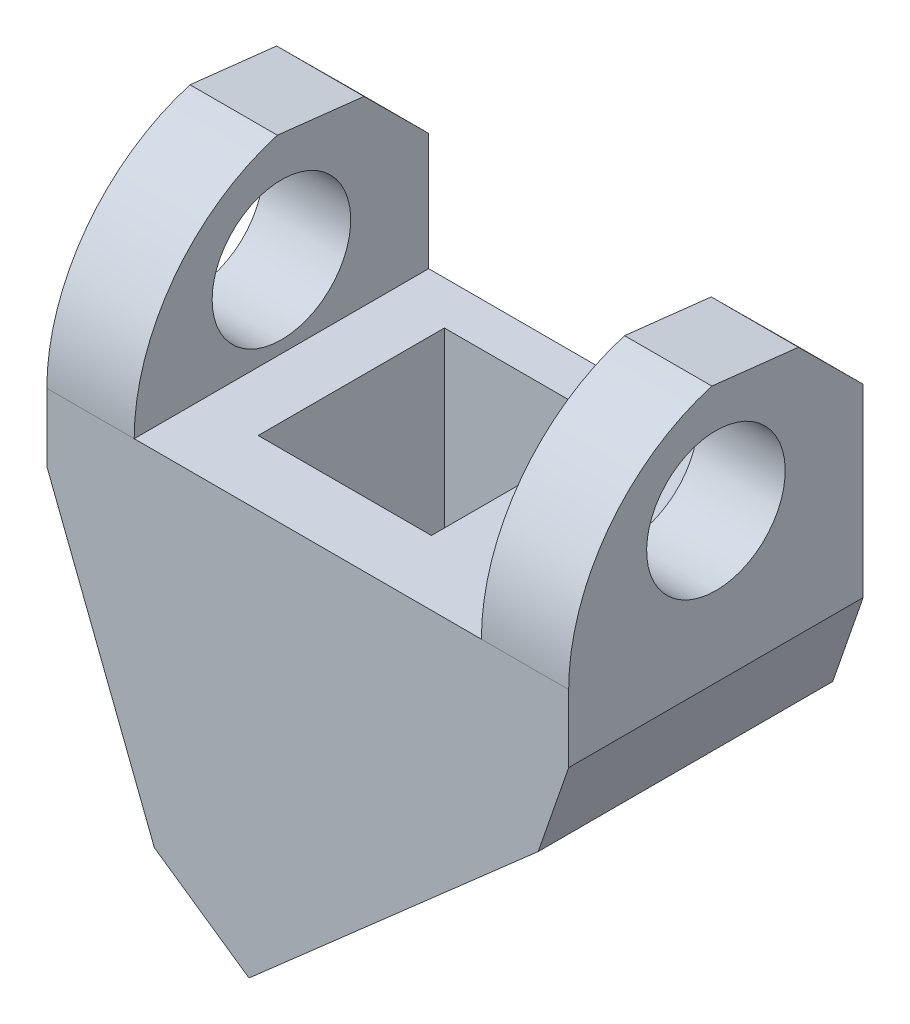
ISO-10303-21;
HEADER;
FILE_DESCRIPTION(('STEP AP214'),'2;1');
FILE_NAME('part.step','',(''),(''),'','','');
FILE_SCHEMA(('AUTOMOTIVE_DESIGN { 1 0 10303 214 1 1 1 1 }'));
ENDSEC;
DATA;
#1=APPLICATION_CONTEXT('core data for automotive mechanical design processes');
#2=APPLICATION_PROTOCOL_DEFINITION('international standard','automotive_design',2000,#1);
#3=PRODUCT_CONTEXT('',#1,'mechanical');
#4=PRODUCT('Part','Part','',(#3));
#5=PRODUCT_RELATED_PRODUCT_CATEGORY('part','',(#4));
#6=PRODUCT_DEFINITION_FORMATION('','',#4);
#7=PRODUCT_DEFINITION_CONTEXT('part definition',#1,'design');
#8=PRODUCT_DEFINITION('design','',#6,#7);
#9=PRODUCT_DEFINITION_SHAPE('','',#8);
#10=(LENGTH_UNIT() NAMED_UNIT(*) SI_UNIT(.MILLI.,.METRE.));
#11=(NAMED_UNIT(*) PLANE_ANGLE_UNIT() SI_UNIT($,.RADIAN.));
#12=(NAMED_UNIT(*) SI_UNIT($,.STERADIAN.) SOLID_ANGLE_UNIT());
#13=UNCERTAINTY_MEASURE_WITH_UNIT(LENGTH_MEASURE(1.E-05),#10,'distance_accuracy_value','');
#14=(GEOMETRIC_REPRESENTATION_CONTEXT(3) GLOBAL_UNCERTAINTY_ASSIGNED_CONTEXT((#13)) GLOBAL_UNIT_ASSIGNED_CONTEXT((#10,
#11,#12)) REPRESENTATION_CONTEXT('',''));
#15=CARTESIAN_POINT('',(0.,0.,0.));
#16=DIRECTION('',(0.,0.,1.));
#17=DIRECTION('',(1.,0.,0.));
#18=AXIS2_PLACEMENT_3D('',#15,#16,#17);
#19=CARTESIAN_POINT('',(-15.0393152654087,68.1555665634377,2.51494935882963));
#20=DIRECTION('',(0.,0.,1.));
#21=DIRECTION('',(0.,-1.,0.));
#22=AXIS2_PLACEMENT_3D('',#19,#20,#21);
#23=PLANE('',#22);
#24=DIRECTION('',(0.,-1.,0.));
#25=VECTOR('',#24,1.);
#26=CARTESIAN_POINT('',(-22.0839997464418,68.1555665634377,2.51494935882964));
#27=LINE('',#26,#25);
#28=CARTESIAN_POINT('',(-22.0839997464418,75.2475364005169,2.51494935882963));
#29=VERTEX_POINT('',#28);
#30=CARTESIAN_POINT('',(-22.0839997464418,73.4824145089119,2.51494935882963));
#31=VERTEX_POINT('',#30);
#32=EDGE_CURVE('E251',#29,#31,#27,.T.);
#33=ORIENTED_EDGE('',*,*,#32,.F.);
#34=DIRECTION('',(0.751257399724713,0.660009332781638,0.));
#35=VECTOR('',#34,1.);
#36=CARTESIAN_POINT('',(-23.163789117237,74.2988987399436,2.51494935882963));
#37=LINE('',#36,#35);
#38=CARTESIAN_POINT('',(-23.1637891172367,74.2988987399439,2.51494935882963));
#39=VERTEX_POINT('',#38);
#40=EDGE_CURVE('E297',#39,#29,#37,.T.);
#41=ORIENTED_EDGE('',*,*,#40,.F.);
#42=DIRECTION('',(-0.797638676251072,0.603135591843523,0.));
#43=VECTOR('',#42,1.);
#44=CARTESIAN_POINT('',(-15.0393152654087,68.1555665634377,2.51494935882963));
#45=LINE('',#44,#43);
#46=EDGE_CURVE('E290',#31,#39,#45,.T.);
#47=ORIENTED_EDGE('',*,*,#46,.F.);
#48=EDGE_LOOP('',(#33,#41,#47));
#49=FACE_BOUND('',#48,.T.);
#50=ADVANCED_FACE('F43',(#49),#23,.T.);
#51=CARTESIAN_POINT('',(-2.1795730675306,80.7846244199642,17.));
#52=DIRECTION('',(-0.660009332781638,0.751257399724713,0.));
#53=DIRECTION('',(-0.751257399724713,-0.660009332781638,0.));
#54=AXIS2_PLACEMENT_3D('',#51,#52,#53);
#55=PLANE('',#54);
#56=DIRECTION('',(0.751257399724713,0.660009332781638,0.));
#57=VECTOR('',#56,1.);
#58=CARTESIAN_POINT('',(-2.1795730675306,80.7846244199642,0.));
#59=LINE('',#58,#57);
#60=CARTESIAN_POINT('',(-18.8741251235288,66.1178002827174,0.));
#61=VERTEX_POINT('',#60);
#62=CARTESIAN_POINT('',(-2.1795730675306,80.7846244199642,0.));
#63=VERTEX_POINT('',#62);
#64=EDGE_CURVE('E399',#61,#63,#59,.T.);
#65=ORIENTED_EDGE('',*,*,#64,.T.);
#66=DIRECTION('',(0.,0.,-1.));
#67=VECTOR('',#66,1.);
#68=CARTESIAN_POINT('',(-2.1795730675306,80.7846244199642,17.));
#69=LINE('',#68,#67);
#70=CARTESIAN_POINT('',(-2.1795730675306,80.7846244199642,17.));
#71=VERTEX_POINT('',#70);
#72=EDGE_CURVE('E429',#71,#63,#69,.T.);
#73=ORIENTED_EDGE('',*,*,#72,.F.);
#74=DIRECTION('',(0.751257399724713,0.660009332781638,0.));
#75=VECTOR('',#74,1.);
#76=CARTESIAN_POINT('',(-2.1795730675306,80.7846244199642,17.));
#77=LINE('',#76,#75);
#78=CARTESIAN_POINT('',(-18.8741251235288,66.1178002827174,17.));
#79=VERTEX_POINT('',#78);
#80=EDGE_CURVE('E376',#79,#71,#77,.T.);
#81=ORIENTED_EDGE('',*,*,#80,.F.);
#82=DIRECTION('',(0.,0.,-1.));
#83=VECTOR('',#82,1.);
#84=CARTESIAN_POINT('',(-18.8741251235288,66.1178002827174,17.));
#85=LINE('',#84,#83);
#86=EDGE_CURVE('E433',#79,#61,#85,.T.);
#87=ORIENTED_EDGE('',*,*,#86,.T.);
#88=EDGE_LOOP('',(#65,#73,#81,#87));
#89=FACE_BOUND('',#88,.T.);
#90=DIRECTION('',(-0.751257399724713,-0.660009332781638,0.));
#91=VECTOR('',#90,1.);
#92=CARTESIAN_POINT('',(-15.6994059763522,68.9069165920742,2.51494935882963));
#93=LINE('',#92,#91);
#94=CARTESIAN_POINT('',(-8.73660731213499,75.0240105499464,2.51494935882963));
#95=VERTEX_POINT('',#94);
#96=CARTESIAN_POINT('',(-12.0839997464418,72.083193929791,2.51494935882963));
#97=VERTEX_POINT('',#96);
#98=EDGE_CURVE('E268',#95,#97,#93,.T.);
#99=ORIENTED_EDGE('',*,*,#98,.T.);
#100=DIRECTION('',(0.,0.,-1.));
#101=VECTOR('',#100,1.);
#102=CARTESIAN_POINT('',(-12.0839997464418,72.083193929791,17.));
#103=LINE('',#102,#101);
#104=CARTESIAN_POINT('',(-12.0839997464418,72.083193929791,2.51));
#105=VERTEX_POINT('',#104);
#106=EDGE_CURVE('E259',#97,#105,#103,.T.);
#107=ORIENTED_EDGE('',*,*,#106,.T.);
#108=DIRECTION('',(-0.751257399724713,-0.660009332781638,0.));
#109=VECTOR('',#108,1.);
#110=CARTESIAN_POINT('',(-2.1795730675306,80.7846244199642,2.51));
#111=LINE('',#110,#109);
#112=CARTESIAN_POINT('',(-15.8536990704591,68.7713640076582,2.51));
#113=VERTEX_POINT('',#112);
#114=EDGE_CURVE('E263',#105,#113,#111,.T.);
#115=ORIENTED_EDGE('',*,*,#114,.T.);
#116=DIRECTION('',(0.,0.,1.));
#117=VECTOR('',#116,1.);
#118=CARTESIAN_POINT('',(-15.8536990704591,68.7713640076582,13.2610917761324));
#119=LINE('',#118,#117);
#120=CARTESIAN_POINT('',(-15.8536990704591,68.7713640076582,13.2610917761324));
#121=VERTEX_POINT('',#120);
#122=EDGE_CURVE('E272',#113,#121,#119,.T.);
#123=ORIENTED_EDGE('',*,*,#122,.T.);
#124=DIRECTION('',(0.751257399724713,0.660009332781638,0.));
#125=VECTOR('',#124,1.);
#126=CARTESIAN_POINT('',(-8.58231421802809,75.1595631343624,13.2610917761324));
#127=LINE('',#126,#125);
#128=CARTESIAN_POINT('',(-8.73660731213499,75.0240105499464,13.2610917761324));
#129=VERTEX_POINT('',#128);
#130=EDGE_CURVE('E276',#121,#129,#127,.T.);
#131=ORIENTED_EDGE('',*,*,#130,.T.);
#132=DIRECTION('',(0.,0.,-1.));
#133=VECTOR('',#132,1.);
#134=CARTESIAN_POINT('',(-8.73660731213499,75.0240105499464,2.51494935882963));
#135=LINE('',#134,#133);
#136=EDGE_CURVE('E273',#129,#95,#135,.T.);
#137=ORIENTED_EDGE('',*,*,#136,.T.);
#138=EDGE_LOOP('',(#99,#107,#115,#123,#131,#137));
#139=FACE_BOUND('',#138,.T.);
#140=ADVANCED_FACE('F499',(#89,#139),#55,.F.);
#141=CARTESIAN_POINT('',(0.,0.,17.));
#142=DIRECTION('',(0.,0.,-1.));
#143=DIRECTION('',(-1.,0.,0.));
#144=AXIS2_PLACEMENT_3D('',#141,#142,#143);
#145=PLANE('',#144);
#146=DIRECTION('',(-1.,0.,0.));
#147=VECTOR('',#146,1.);
#148=CARTESIAN_POINT('',(18.4980253948452,89.7634252905846,17.));
#149=LINE('',#148,#147);
#150=CARTESIAN_POINT('',(-30.5439997464418,89.7634252905846,17.));
#151=VERTEX_POINT('',#150);
#152=CARTESIAN_POINT('',(-25.5019746051548,89.7634252905846,17.));
#153=VERTEX_POINT('',#152);
#154=EDGE_CURVE('E452',#151,#153,#149,.F.);
#155=ORIENTED_EDGE('',*,*,#154,.F.);
#156=DIRECTION('',(0.,-1.,0.));
#157=VECTOR('',#156,1.);
#158=CARTESIAN_POINT('',(-30.5439997464418,85.8614227175712,17.));
#159=LINE('',#158,#157);
#160=CARTESIAN_POINT('',(-30.5439997464418,85.8614227175712,17.));
#161=VERTEX_POINT('',#160);
#162=EDGE_CURVE('E366',#151,#161,#159,.T.);
#163=ORIENTED_EDGE('',*,*,#162,.T.);
#164=DIRECTION('',(0.362427694111266,-0.932011891845373,0.));
#165=VECTOR('',#164,1.);
#166=CARTESIAN_POINT('',(-24.3369525661396,69.899502921478,17.));
#167=LINE('',#166,#165);
#168=CARTESIAN_POINT('',(-24.3369525661396,69.899502921478,17.));
#169=VERTEX_POINT('',#168);
#170=EDGE_CURVE('E369',#161,#169,#167,.T.);
#171=ORIENTED_EDGE('',*,*,#170,.T.);
#172=DIRECTION('',(0.822210140525287,-0.569184051794661,0.));
#173=VECTOR('',#172,1.);
#174=CARTESIAN_POINT('',(-18.8741251235288,66.1178002827174,17.));
#175=LINE('',#174,#173);
#176=EDGE_CURVE('E373',#169,#79,#175,.T.);
#177=ORIENTED_EDGE('',*,*,#176,.T.);
#178=ORIENTED_EDGE('',*,*,#80,.T.);
#179=DIRECTION('',(0.327290063128933,0.944923919994123,0.));
#180=VECTOR('',#179,1.);
#181=CARTESIAN_POINT('',(-0.421139822103817,85.8614227175712,17.));
#182=LINE('',#181,#180);
#183=CARTESIAN_POINT('',(-0.421139822103817,85.8614227175712,17.));
#184=VERTEX_POINT('',#183);
#185=EDGE_CURVE('E379',#71,#184,#182,.T.);
#186=ORIENTED_EDGE('',*,*,#185,.T.);
#187=DIRECTION('',(0.,1.,0.));
#188=VECTOR('',#187,1.);
#189=CARTESIAN_POINT('',(-0.421139822103861,100.861422717571,17.));
#190=LINE('',#189,#188);
#191=CARTESIAN_POINT('',(-0.421139822103841,89.7634252905846,17.));
#192=VERTEX_POINT('',#191);
#193=EDGE_CURVE('E382',#184,#192,#190,.T.);
#194=ORIENTED_EDGE('',*,*,#193,.T.);
#195=CARTESIAN_POINT('',(-5.45945062258354,89.7634252905846,17.));
#196=VERTEX_POINT('',#195);
#197=EDGE_CURVE('E449',#196,#192,#149,.F.);
#198=ORIENTED_EDGE('',*,*,#197,.F.);
#199=DIRECTION('',(-1.,0.,0.));
#200=VECTOR('',#199,1.);
#201=CARTESIAN_POINT('',(-25.5019746051548,89.7634252905846,17.));
#202=LINE('',#201,#200);
#203=EDGE_CURVE('E386',#196,#153,#202,.T.);
#204=ORIENTED_EDGE('',*,*,#203,.T.);
#205=EDGE_LOOP('',(#155,#163,#171,#177,#178,#186,#194,#198,#204));
#206=FACE_BOUND('',#205,.T.);
#207=ADVANCED_FACE('F468',(#206),#145,.F.);
#208=CARTESIAN_POINT('',(-30.5439997464418,85.8614227175712,17.));
#209=DIRECTION('',(1.,0.,0.));
#210=DIRECTION('',(0.,1.,0.));
#211=AXIS2_PLACEMENT_3D('',#208,#209,#210);
#212=PLANE('',#211);
#213=CARTESIAN_POINT('',(-30.5439997464418,94.4592808428831,8.5));
#214=DIRECTION('',(-1.,0.,0.));
#215=DIRECTION('',(0.,-1.,0.));
#216=AXIS2_PLACEMENT_3D('',#213,#214,#215);
#217=CIRCLE('',#216,4.);
#218=CARTESIAN_POINT('',(-30.5439997464418,90.4592808428831,8.5));
#219=VERTEX_POINT('',#218);
#220=EDGE_CURVE('E541',#219,#219,#217,.T.);
#221=ORIENTED_EDGE('',*,*,#220,.F.);
#222=EDGE_LOOP('',(#221));
#223=FACE_BOUND('',#222,.T.);
#224=ORIENTED_EDGE('',*,*,#162,.F.);
#225=CARTESIAN_POINT('',(-30.5439997464418,89.7634252905846,5.49450288206386));
#226=DIRECTION('',(1.,0.,0.));
#227=DIRECTION('',(0.,1.,0.));
#228=AXIS2_PLACEMENT_3D('',#225,#226,#227);
#229=CIRCLE('',#228,11.5054971179361);
#230=CARTESIAN_POINT('',(-30.5439997464418,100.803448871588,8.73400026001036));
#231=VERTEX_POINT('',#230);
#232=EDGE_CURVE('E349',#151,#231,#229,.F.);
#233=ORIENTED_EDGE('',*,*,#232,.T.);
#234=DIRECTION('',(0.,-0.111700323808087,-0.9937419371553));
#235=VECTOR('',#234,1.);
#236=CARTESIAN_POINT('',(-30.5439997464418,101.534554459212,15.2382811621701));
#237=LINE('',#236,#235);
#238=CARTESIAN_POINT('',(-30.5439997464418,100.241430103779,3.73400026001036));
#239=VERTEX_POINT('',#238);
#240=EDGE_CURVE('E361',#231,#239,#237,.T.);
#241=ORIENTED_EDGE('',*,*,#240,.T.);
#242=DIRECTION('',(0.,-0.705206396881613,-0.709002071786291));
#243=VECTOR('',#242,1.);
#244=CARTESIAN_POINT('',(-30.5439997464418,99.7229257634078,3.21270514246909));
#245=LINE('',#244,#243);
#246=CARTESIAN_POINT('',(-30.5439997464418,96.5274199843407,0.));
#247=VERTEX_POINT('',#246);
#248=EDGE_CURVE('E333',#239,#247,#245,.T.);
#249=ORIENTED_EDGE('',*,*,#248,.T.);
#250=DIRECTION('',(0.,-1.,0.));
#251=VECTOR('',#250,1.);
#252=CARTESIAN_POINT('',(-30.5439997464418,85.8614227175712,0.));
#253=LINE('',#252,#251);
#254=CARTESIAN_POINT('',(-30.5439997464418,85.8614227175712,0.));
#255=VERTEX_POINT('',#254);
#256=EDGE_CURVE('E365',#247,#255,#253,.T.);
#257=ORIENTED_EDGE('',*,*,#256,.T.);
#258=DIRECTION('',(0.,0.,-1.));
#259=VECTOR('',#258,1.);
#260=CARTESIAN_POINT('',(-30.5439997464418,85.8614227175712,17.));
#261=LINE('',#260,#259);
#262=EDGE_CURVE('E441',#161,#255,#261,.T.);
#263=ORIENTED_EDGE('',*,*,#262,.F.);
#264=EDGE_LOOP('',(#224,#233,#241,#249,#257,#263));
#265=FACE_BOUND('',#264,.T.);
#266=ADVANCED_FACE('F45',(#223,#265),#212,.F.);
#267=CARTESIAN_POINT('',(-24.3369525661396,69.899502921478,17.));
#268=DIRECTION('',(0.932011891845373,0.362427694111266,0.));
#269=DIRECTION('',(-0.362427694111266,0.932011891845373,0.));
#270=AXIS2_PLACEMENT_3D('',#267,#268,#269);
#271=PLANE('',#270);
#272=DIRECTION('',(0.362427694111266,-0.932011891845373,0.));
#273=VECTOR('',#272,1.);
#274=CARTESIAN_POINT('',(-24.3369525661396,69.899502921478,0.));
#275=LINE('',#274,#273);
#276=CARTESIAN_POINT('',(-24.3369525661396,69.899502921478,0.));
#277=VERTEX_POINT('',#276);
#278=EDGE_CURVE('E393',#255,#277,#275,.T.);
#279=ORIENTED_EDGE('',*,*,#278,.T.);
#280=DIRECTION('',(0.,0.,-1.));
#281=VECTOR('',#280,1.);
#282=CARTESIAN_POINT('',(-24.3369525661396,69.899502921478,17.));
#283=LINE('',#282,#281);
#284=EDGE_CURVE('E437',#169,#277,#283,.T.);
#285=ORIENTED_EDGE('',*,*,#284,.F.);
#286=ORIENTED_EDGE('',*,*,#170,.F.);
#287=ORIENTED_EDGE('',*,*,#262,.T.);
#288=EDGE_LOOP('',(#279,#285,#286,#287));
#289=FACE_BOUND('',#288,.T.);
#290=ADVANCED_FACE('F487',(#289),#271,.F.);
#291=CARTESIAN_POINT('',(-18.8741251235288,66.1178002827174,17.));
#292=DIRECTION('',(0.569184051794661,0.822210140525287,0.));
#293=DIRECTION('',(-0.822210140525287,0.569184051794661,0.));
#294=AXIS2_PLACEMENT_3D('',#291,#292,#293);
#295=PLANE('',#294);
#296=DIRECTION('',(0.822210140525287,-0.569184051794661,0.));
#297=VECTOR('',#296,1.);
#298=CARTESIAN_POINT('',(-18.8741251235288,66.1178002827174,0.));
#299=LINE('',#298,#297);
#300=EDGE_CURVE('E396',#277,#61,#299,.T.);
#301=ORIENTED_EDGE('',*,*,#300,.T.);
#302=ORIENTED_EDGE('',*,*,#86,.F.);
#303=ORIENTED_EDGE('',*,*,#176,.F.);
#304=ORIENTED_EDGE('',*,*,#284,.T.);
#305=EDGE_LOOP('',(#301,#302,#303,#304));
#306=FACE_BOUND('',#305,.T.);
#307=ADVANCED_FACE('F493',(#306),#295,.F.);
#308=CARTESIAN_POINT('',(-0.421139822103817,85.8614227175712,17.));
#309=DIRECTION('',(-0.944923919994123,0.327290063128933,0.));
#310=DIRECTION('',(-0.327290063128933,-0.944923919994123,0.));
#311=AXIS2_PLACEMENT_3D('',#308,#309,#310);
#312=PLANE('',#311);
#313=DIRECTION('',(0.327290063128933,0.944923919994123,0.));
#314=VECTOR('',#313,1.);
#315=CARTESIAN_POINT('',(-0.421139822103817,85.8614227175712,0.));
#316=LINE('',#315,#314);
#317=CARTESIAN_POINT('',(-0.421139822103817,85.8614227175712,0.));
#318=VERTEX_POINT('',#317);
#319=EDGE_CURVE('E402',#63,#318,#316,.T.);
#320=ORIENTED_EDGE('',*,*,#319,.T.);
#321=DIRECTION('',(0.,0.,-1.));
#322=VECTOR('',#321,1.);
#323=CARTESIAN_POINT('',(-0.421139822103817,85.8614227175712,17.));
#324=LINE('',#323,#322);
#325=EDGE_CURVE('E425',#184,#318,#324,.T.);
#326=ORIENTED_EDGE('',*,*,#325,.F.);
#327=ORIENTED_EDGE('',*,*,#185,.F.);
#328=ORIENTED_EDGE('',*,*,#72,.T.);
#329=EDGE_LOOP('',(#320,#326,#327,#328));
#330=FACE_BOUND('',#329,.T.);
#331=ADVANCED_FACE('F504',(#330),#312,.F.);
#332=CARTESIAN_POINT('',(-0.421139822103861,100.861422717571,17.));
#333=DIRECTION('',(-1.,0.,0.));
#334=DIRECTION('',(0.,-1.,0.));
#335=AXIS2_PLACEMENT_3D('',#332,#333,#334);
#336=PLANE('',#335);
#337=CARTESIAN_POINT('',(-0.421139822103817,94.4592808428831,8.5));
#338=DIRECTION('',(-1.,0.,0.));
#339=DIRECTION('',(0.,-1.,0.));
#340=AXIS2_PLACEMENT_3D('',#337,#338,#339);
#341=CIRCLE('',#340,4.);
#342=CARTESIAN_POINT('',(-0.421139822103816,90.4592808428831,8.5));
#343=VERTEX_POINT('',#342);
#344=EDGE_CURVE('E536',#343,#343,#341,.T.);
#345=ORIENTED_EDGE('',*,*,#344,.T.);
#346=EDGE_LOOP('',(#345));
#347=FACE_BOUND('',#346,.T.);
#348=DIRECTION('',(0.,0.111700323808087,0.9937419371553));
#349=VECTOR('',#348,1.);
#350=CARTESIAN_POINT('',(-0.421139822103864,101.721708894294,16.903300604599));
#351=LINE('',#350,#349);
#352=CARTESIAN_POINT('',(-0.421139822103855,100.241430103779,3.73400026001036));
#353=VERTEX_POINT('',#352);
#354=CARTESIAN_POINT('',(-0.421139822103862,100.803448871588,8.73400026001036));
#355=VERTEX_POINT('',#354);
#356=EDGE_CURVE('E357',#353,#355,#351,.T.);
#357=ORIENTED_EDGE('',*,*,#356,.T.);
#358=CARTESIAN_POINT('',(-0.42113982210383,89.7634252905846,5.49450288206386));
#359=DIRECTION('',(-1.,0.,0.));
#360=DIRECTION('',(0.,-1.,0.));
#361=AXIS2_PLACEMENT_3D('',#358,#359,#360);
#362=CIRCLE('',#361,11.5054971179361);
#363=EDGE_CURVE('E345',#355,#192,#362,.F.);
#364=ORIENTED_EDGE('',*,*,#363,.T.);
#365=ORIENTED_EDGE('',*,*,#193,.F.);
#366=ORIENTED_EDGE('',*,*,#325,.T.);
#367=DIRECTION('',(0.,1.,0.));
#368=VECTOR('',#367,1.);
#369=CARTESIAN_POINT('',(-0.421139822103861,100.861422717571,0.));
#370=LINE('',#369,#368);
#371=CARTESIAN_POINT('',(-0.421139822103848,96.5274199843407,0.));
#372=VERTEX_POINT('',#371);
#373=EDGE_CURVE('E405',#318,#372,#370,.T.);
#374=ORIENTED_EDGE('',*,*,#373,.T.);
#375=DIRECTION('',(0.,0.705206396881613,0.709002071786291));
#376=VECTOR('',#375,1.);
#377=CARTESIAN_POINT('',(-0.42113982210388,107.182666696449,10.7125970888592));
#378=LINE('',#377,#376);
#379=EDGE_CURVE('E329',#372,#353,#378,.T.);
#380=ORIENTED_EDGE('',*,*,#379,.T.);
#381=EDGE_LOOP('',(#357,#364,#365,#366,#374,#380));
#382=FACE_BOUND('',#381,.T.);
#383=ADVANCED_FACE('F508',(#347,#382),#336,.F.);
#384=CARTESIAN_POINT('',(-5.45945062258354,89.7634252905846,17.));
#385=DIRECTION('',(1.,0.,0.));
#386=DIRECTION('',(0.,1.,0.));
#387=AXIS2_PLACEMENT_3D('',#384,#385,#386);
#388=PLANE('',#387);
#389=CARTESIAN_POINT('',(-5.45945062258354,94.4592808428831,8.5));
#390=DIRECTION('',(1.,0.,0.));
#391=DIRECTION('',(0.,1.,0.));
#392=AXIS2_PLACEMENT_3D('',#389,#390,#391);
#393=CIRCLE('',#392,4.);
#394=CARTESIAN_POINT('',(-5.45945062258354,98.4592808428831,8.5));
#395=VERTEX_POINT('',#394);
#396=EDGE_CURVE('E527',#395,#395,#393,.T.);
#397=ORIENTED_EDGE('',*,*,#396,.T.);
#398=EDGE_LOOP('',(#397));
#399=FACE_BOUND('',#398,.T.);
#400=DIRECTION('',(0.,0.,-1.));
#401=VECTOR('',#400,1.);
#402=CARTESIAN_POINT('',(-5.45945062258354,89.7634252905846,17.));
#403=LINE('',#402,#401);
#404=CARTESIAN_POINT('',(-5.45945062258354,89.7634252905846,0.));
#405=VERTEX_POINT('',#404);
#406=EDGE_CURVE('E421',#196,#405,#403,.T.);
#407=ORIENTED_EDGE('',*,*,#406,.F.);
#408=CARTESIAN_POINT('',(-5.45945062258354,89.7634252905846,5.49450288206386));
#409=DIRECTION('',(1.,0.,0.));
#410=DIRECTION('',(0.,1.,0.));
#411=AXIS2_PLACEMENT_3D('',#408,#409,#410);
#412=CIRCLE('',#411,11.5054971179361);
#413=CARTESIAN_POINT('',(-5.45945062258354,100.803448871588,8.73400026001036));
#414=VERTEX_POINT('',#413);
#415=EDGE_CURVE('E341',#196,#414,#412,.F.);
#416=ORIENTED_EDGE('',*,*,#415,.T.);
#417=DIRECTION('',(0.,-0.111700323808087,-0.9937419371553));
#418=VECTOR('',#417,1.);
#419=CARTESIAN_POINT('',(-5.45945062258354,101.583239598361,15.6714085054018));
#420=LINE('',#419,#418);
#421=CARTESIAN_POINT('',(-5.45945062258354,100.241430103779,3.73400026001036));
#422=VERTEX_POINT('',#421);
#423=EDGE_CURVE('E353',#414,#422,#420,.T.);
#424=ORIENTED_EDGE('',*,*,#423,.T.);
#425=DIRECTION('',(0.,-0.705206396881613,-0.709002071786291));
#426=VECTOR('',#425,1.);
#427=CARTESIAN_POINT('',(-5.45945062258354,101.663454317724,5.1636783206115));
#428=LINE('',#427,#426);
#429=CARTESIAN_POINT('',(-5.45945062258354,96.5274199843407,0.));
#430=VERTEX_POINT('',#429);
#431=EDGE_CURVE('E325',#422,#430,#428,.T.);
#432=ORIENTED_EDGE('',*,*,#431,.T.);
#433=DIRECTION('',(0.,-1.,0.));
#434=VECTOR('',#433,1.);
#435=CARTESIAN_POINT('',(-5.45945062258354,89.7634252905846,0.));
#436=LINE('',#435,#434);
#437=EDGE_CURVE('E409',#430,#405,#436,.T.);
#438=ORIENTED_EDGE('',*,*,#437,.T.);
#439=EDGE_LOOP('',(#407,#416,#424,#432,#438));
#440=FACE_BOUND('',#439,.T.);
#441=ADVANCED_FACE('F654',(#399,#440),#388,.F.);
#442=CARTESIAN_POINT('',(-25.5019746051548,89.7634252905846,17.));
#443=DIRECTION('',(0.,-1.,0.));
#444=DIRECTION('',(0.,0.,-1.));
#445=AXIS2_PLACEMENT_3D('',#442,#443,#444);
#446=PLANE('',#445);
#447=DIRECTION('',(1.,0.,0.));
#448=VECTOR('',#447,1.);
#449=CARTESIAN_POINT('',(-22.0839997464418,89.7634252905846,13.26));
#450=LINE('',#449,#448);
#451=CARTESIAN_POINT('',(-22.0839997464418,89.7634252905846,13.26));
#452=VERTEX_POINT('',#451);
#453=CARTESIAN_POINT('',(-12.0839997464418,89.7634252905846,13.26));
#454=VERTEX_POINT('',#453);
#455=EDGE_CURVE('E222',#452,#454,#450,.T.);
#456=ORIENTED_EDGE('',*,*,#455,.F.);
#457=DIRECTION('',(0.,0.,1.));
#458=VECTOR('',#457,1.);
#459=CARTESIAN_POINT('',(-22.0839997464418,89.7634252905846,2.51));
#460=LINE('',#459,#458);
#461=CARTESIAN_POINT('',(-22.0839997464418,89.7634252905846,2.51));
#462=VERTEX_POINT('',#461);
#463=EDGE_CURVE('E60',#462,#452,#460,.T.);
#464=ORIENTED_EDGE('',*,*,#463,.F.);
#465=DIRECTION('',(-1.,0.,0.));
#466=VECTOR('',#465,1.);
#467=CARTESIAN_POINT('',(-22.0839997464418,89.7634252905846,2.51));
#468=LINE('',#467,#466);
#469=CARTESIAN_POINT('',(-12.0839997464418,89.7634252905846,2.51));
#470=VERTEX_POINT('',#469);
#471=EDGE_CURVE('E230',#470,#462,#468,.T.);
#472=ORIENTED_EDGE('',*,*,#471,.F.);
#473=DIRECTION('',(0.,0.,-1.));
#474=VECTOR('',#473,1.);
#475=CARTESIAN_POINT('',(-12.0839997464418,89.7634252905846,2.51));
#476=LINE('',#475,#474);
#477=EDGE_CURVE('E211',#454,#470,#476,.T.);
#478=ORIENTED_EDGE('',*,*,#477,.F.);
#479=EDGE_LOOP('',(#456,#464,#472,#478));
#480=FACE_BOUND('',#479,.T.);
#481=DIRECTION('',(-1.,0.,0.));
#482=VECTOR('',#481,1.);
#483=CARTESIAN_POINT('',(-25.5019746051548,89.7634252905846,0.));
#484=LINE('',#483,#482);
#485=CARTESIAN_POINT('',(-25.5019746051548,89.7634252905846,0.));
#486=VERTEX_POINT('',#485);
#487=EDGE_CURVE('E412',#405,#486,#484,.T.);
#488=ORIENTED_EDGE('',*,*,#487,.T.);
#489=DIRECTION('',(0.,0.,-1.));
#490=VECTOR('',#489,1.);
#491=CARTESIAN_POINT('',(-25.5019746051548,89.7634252905846,17.));
#492=LINE('',#491,#490);
#493=EDGE_CURVE('E390',#153,#486,#492,.T.);
#494=ORIENTED_EDGE('',*,*,#493,.F.);
#495=ORIENTED_EDGE('',*,*,#203,.F.);
#496=ORIENTED_EDGE('',*,*,#406,.T.);
#497=EDGE_LOOP('',(#488,#494,#495,#496));
#498=FACE_BOUND('',#497,.T.);
#499=ADVANCED_FACE('F227',(#480,#498),#446,.F.);
#500=CARTESIAN_POINT('',(-25.5019746051548,100.861422717571,17.));
#501=DIRECTION('',(-1.,0.,0.));
#502=DIRECTION('',(0.,0.,1.));
#503=AXIS2_PLACEMENT_3D('',#500,#501,#502);
#504=PLANE('',#503);
#505=CARTESIAN_POINT('',(-25.5019746051548,94.4592808428831,8.5));
#506=DIRECTION('',(-1.,0.,0.));
#507=DIRECTION('',(0.,0.,1.));
#508=AXIS2_PLACEMENT_3D('',#505,#506,#507);
#509=CIRCLE('',#508,4.);
#510=CARTESIAN_POINT('',(-25.5019746051548,94.4592808428831,12.5));
#511=VERTEX_POINT('',#510);
#512=EDGE_CURVE('E47',#511,#511,#509,.T.);
#513=ORIENTED_EDGE('',*,*,#512,.T.);
#514=EDGE_LOOP('',(#513));
#515=FACE_BOUND('',#514,.T.);
#516=DIRECTION('',(0.,0.111700323808087,0.9937419371553));
#517=VECTOR('',#516,1.);
#518=CARTESIAN_POINT('',(-25.5019746051548,101.721708894294,16.903300604599));
#519=LINE('',#518,#517);
#520=CARTESIAN_POINT('',(-25.5019746051548,100.241430103779,3.73400026001036));
#521=VERTEX_POINT('',#520);
#522=CARTESIAN_POINT('',(-25.5019746051548,100.803448871588,8.73400026001036));
#523=VERTEX_POINT('',#522);
#524=EDGE_CURVE('E53',#521,#523,#519,.T.);
#525=ORIENTED_EDGE('',*,*,#524,.T.);
#526=CARTESIAN_POINT('',(-25.5019746051548,89.7634252905846,5.49450288206386));
#527=DIRECTION('',(-1.,0.,0.));
#528=DIRECTION('',(0.,0.,1.));
#529=AXIS2_PLACEMENT_3D('',#526,#527,#528);
#530=CIRCLE('',#529,11.5054971179361);
#531=EDGE_CURVE('E337',#523,#153,#530,.F.);
#532=ORIENTED_EDGE('',*,*,#531,.T.);
#533=ORIENTED_EDGE('',*,*,#493,.T.);
#534=DIRECTION('',(0.,1.,0.));
#535=VECTOR('',#534,1.);
#536=CARTESIAN_POINT('',(-25.5019746051548,100.861422717571,0.));
#537=LINE('',#536,#535);
#538=CARTESIAN_POINT('',(-25.5019746051548,96.5274199843407,0.));
#539=VERTEX_POINT('',#538);
#540=EDGE_CURVE('E370',#486,#539,#537,.T.);
#541=ORIENTED_EDGE('',*,*,#540,.T.);
#542=DIRECTION('',(0.,0.705206396881613,0.709002071786291));
#543=VECTOR('',#542,1.);
#544=CARTESIAN_POINT('',(-25.5019746051548,107.182666696449,10.7125970888592));
#545=LINE('',#544,#543);
#546=EDGE_CURVE('E321',#539,#521,#545,.T.);
#547=ORIENTED_EDGE('',*,*,#546,.T.);
#548=EDGE_LOOP('',(#525,#532,#533,#541,#547));
#549=FACE_BOUND('',#548,.T.);
#550=ADVANCED_FACE('F463',(#515,#549),#504,.F.);
#551=CARTESIAN_POINT('',(0.,0.,0.));
#552=DIRECTION('',(0.,0.,-1.));
#553=DIRECTION('',(-1.,0.,0.));
#554=AXIS2_PLACEMENT_3D('',#551,#552,#553);
#555=PLANE('',#554);
#556=DIRECTION('',(-1.,0.,0.));
#557=VECTOR('',#556,1.);
#558=CARTESIAN_POINT('',(0.,96.5274199843407,0.));
#559=LINE('',#558,#557);
#560=EDGE_CURVE('E448',#372,#430,#559,.T.);
#561=ORIENTED_EDGE('',*,*,#560,.F.);
#562=ORIENTED_EDGE('',*,*,#373,.F.);
#563=ORIENTED_EDGE('',*,*,#319,.F.);
#564=ORIENTED_EDGE('',*,*,#64,.F.);
#565=ORIENTED_EDGE('',*,*,#300,.F.);
#566=ORIENTED_EDGE('',*,*,#278,.F.);
#567=ORIENTED_EDGE('',*,*,#256,.F.);
#568=EDGE_CURVE('E445',#539,#247,#559,.T.);
#569=ORIENTED_EDGE('',*,*,#568,.F.);
#570=ORIENTED_EDGE('',*,*,#540,.F.);
#571=ORIENTED_EDGE('',*,*,#487,.F.);
#572=ORIENTED_EDGE('',*,*,#437,.F.);
#573=EDGE_LOOP('',(#561,#562,#563,#564,#565,#566,#567,#569,#570,#571,#572));
#574=FACE_BOUND('',#573,.T.);
#575=ADVANCED_FACE('F474',(#574),#555,.T.);
#576=CARTESIAN_POINT('',(18.4980253948452,48.5227835831376,-48.2630146497583));
#577=DIRECTION('',(0.,-0.709002071786291,0.705206396881613));
#578=DIRECTION('',(0.,-0.705206396881613,-0.709002071786291));
#579=AXIS2_PLACEMENT_3D('',#576,#577,#578);
#580=PLANE('',#579);
#581=DIRECTION('',(-1.,0.,0.));
#582=VECTOR('',#581,1.);
#583=CARTESIAN_POINT('',(18.4980253948452,100.241430103779,3.73400026001036));
#584=LINE('',#583,#582);
#585=EDGE_CURVE('E280',#521,#239,#584,.T.);
#586=ORIENTED_EDGE('',*,*,#585,.F.);
#587=ORIENTED_EDGE('',*,*,#546,.F.);
#588=ORIENTED_EDGE('',*,*,#568,.T.);
#589=ORIENTED_EDGE('',*,*,#248,.F.);
#590=EDGE_LOOP('',(#586,#587,#588,#589));
#591=FACE_BOUND('',#590,.T.);
#592=ADVANCED_FACE('F479',(#591),#580,.F.);
#593=CARTESIAN_POINT('',(18.4980253948452,89.7634252905846,5.49450288206386));
#594=DIRECTION('',(-1.,0.,0.));
#595=DIRECTION('',(0.,0.,1.));
#596=AXIS2_PLACEMENT_3D('',#593,#594,#595);
#597=CYLINDRICAL_SURFACE('',#596,11.5054971179361);
#598=ORIENTED_EDGE('',*,*,#154,.T.);
#599=ORIENTED_EDGE('',*,*,#531,.F.);
#600=DIRECTION('',(-1.,0.,0.));
#601=VECTOR('',#600,1.);
#602=CARTESIAN_POINT('',(18.4980253948452,100.803448871588,8.73400026001036));
#603=LINE('',#602,#601);
#604=EDGE_CURVE('E316',#523,#231,#603,.T.);
#605=ORIENTED_EDGE('',*,*,#604,.T.);
#606=ORIENTED_EDGE('',*,*,#232,.F.);
#607=EDGE_LOOP('',(#598,#599,#605,#606));
#608=FACE_BOUND('',#607,.T.);
#609=ADVANCED_FACE('F459',(#608),#597,.T.);
#610=CARTESIAN_POINT('',(18.4980253948452,98.5762426868533,-11.0803396900269));
#611=DIRECTION('',(0.,-0.9937419371553,0.111700323808087));
#612=DIRECTION('',(0.,-0.111700323808087,-0.9937419371553));
#613=AXIS2_PLACEMENT_3D('',#610,#611,#612);
#614=PLANE('',#613);
#615=ORIENTED_EDGE('',*,*,#604,.F.);
#616=ORIENTED_EDGE('',*,*,#524,.F.);
#617=ORIENTED_EDGE('',*,*,#585,.T.);
#618=ORIENTED_EDGE('',*,*,#240,.F.);
#619=EDGE_LOOP('',(#615,#616,#617,#618));
#620=FACE_BOUND('',#619,.T.);
#621=ADVANCED_FACE('F481',(#620),#614,.F.);
#622=EDGE_CURVE('E315',#353,#422,#584,.T.);
#623=ORIENTED_EDGE('',*,*,#622,.T.);
#624=ORIENTED_EDGE('',*,*,#423,.F.);
#625=EDGE_CURVE('E320',#355,#414,#603,.T.);
#626=ORIENTED_EDGE('',*,*,#625,.F.);
#627=ORIENTED_EDGE('',*,*,#356,.F.);
#628=EDGE_LOOP('',(#623,#624,#626,#627));
#629=FACE_BOUND('',#628,.T.);
#630=ADVANCED_FACE('F515',(#629),#614,.F.);
#631=ORIENTED_EDGE('',*,*,#625,.T.);
#632=ORIENTED_EDGE('',*,*,#415,.F.);
#633=ORIENTED_EDGE('',*,*,#197,.T.);
#634=ORIENTED_EDGE('',*,*,#363,.F.);
#635=EDGE_LOOP('',(#631,#632,#633,#634));
#636=FACE_BOUND('',#635,.T.);
#637=ADVANCED_FACE('F512',(#636),#597,.T.);
#638=ORIENTED_EDGE('',*,*,#560,.T.);
#639=ORIENTED_EDGE('',*,*,#431,.F.);
#640=ORIENTED_EDGE('',*,*,#622,.F.);
#641=ORIENTED_EDGE('',*,*,#379,.F.);
#642=EDGE_LOOP('',(#638,#639,#640,#641));
#643=FACE_BOUND('',#642,.T.);
#644=ADVANCED_FACE('F731',(#643),#580,.F.);
#645=CARTESIAN_POINT('',(-48.3155362733478,52.2020942826695,0.));
#646=DIRECTION('',(0.660009332781638,-0.751257399724713,0.));
#647=DIRECTION('',(0.751257399724713,0.660009332781638,0.));
#648=AXIS2_PLACEMENT_3D('',#645,#646,#647);
#649=PLANE('',#648);
#650=DIRECTION('',(0.,0.,-1.));
#651=VECTOR('',#650,1.);
#652=CARTESIAN_POINT('',(-22.0839997464418,75.2475364005169,0.));
#653=LINE('',#652,#651);
#654=CARTESIAN_POINT('',(-22.0839997464418,75.2475364005169,13.26));
#655=VERTEX_POINT('',#654);
#656=EDGE_CURVE('E254',#655,#29,#653,.T.);
#657=ORIENTED_EDGE('',*,*,#656,.F.);
#658=DIRECTION('',(-0.751257399724713,-0.660009332781638,0.));
#659=VECTOR('',#658,1.);
#660=CARTESIAN_POINT('',(-48.3155362733478,52.2020942826695,13.26));
#661=LINE('',#660,#659);
#662=CARTESIAN_POINT('',(-16.0466973589124,80.5515452822325,13.26));
#663=VERTEX_POINT('',#662);
#664=EDGE_CURVE('E248',#663,#655,#661,.T.);
#665=ORIENTED_EDGE('',*,*,#664,.F.);
#666=DIRECTION('',(0.,0.,1.));
#667=VECTOR('',#666,1.);
#668=CARTESIAN_POINT('',(-16.0466973589129,80.5515452822318,2.51494935882963));
#669=LINE('',#668,#667);
#670=CARTESIAN_POINT('',(-16.0466973589127,80.5515452822322,13.2610917761324));
#671=VERTEX_POINT('',#670);
#672=EDGE_CURVE('E303',#663,#671,#669,.T.);
#673=ORIENTED_EDGE('',*,*,#672,.T.);
#674=DIRECTION('',(-0.751257399724713,-0.660009332781638,0.));
#675=VECTOR('',#674,1.);
#676=CARTESIAN_POINT('',(-16.0466973589129,80.5515452822318,13.2610917761324));
#677=LINE('',#676,#675);
#678=CARTESIAN_POINT('',(-23.1637891172367,74.2988987399439,13.2610917761324));
#679=VERTEX_POINT('',#678);
#680=EDGE_CURVE('E281',#671,#679,#677,.T.);
#681=ORIENTED_EDGE('',*,*,#680,.T.);
#682=DIRECTION('',(0.,0.,-1.));
#683=VECTOR('',#682,1.);
#684=CARTESIAN_POINT('',(-23.163789117237,74.2988987399436,13.2610917761324));
#685=LINE('',#684,#683);
#686=EDGE_CURVE('E285',#679,#39,#685,.T.);
#687=ORIENTED_EDGE('',*,*,#686,.T.);
#688=ORIENTED_EDGE('',*,*,#40,.T.);
#689=EDGE_LOOP('',(#657,#665,#673,#681,#687,#688));
#690=FACE_BOUND('',#689,.T.);
#691=ADVANCED_FACE('F578',(#690),#649,.T.);
#692=CARTESIAN_POINT('',(-7.92222350708465,74.4082131057259,2.51494935882963));
#693=DIRECTION('',(-0.603135591843523,-0.797638676251072,0.));
#694=DIRECTION('',(0.797638676251072,-0.603135591843523,0.));
#695=AXIS2_PLACEMENT_3D('',#692,#693,#694);
#696=PLANE('',#695);
#697=DIRECTION('',(0.,0.,1.));
#698=VECTOR('',#697,1.);
#699=CARTESIAN_POINT('',(-12.0839997464418,77.5551459839592,2.51494935882963));
#700=LINE('',#699,#698);
#701=CARTESIAN_POINT('',(-12.0839997464418,77.5551459839592,2.51494935882963));
#702=VERTEX_POINT('',#701);
#703=CARTESIAN_POINT('',(-12.0839997464418,77.5551459839592,13.26));
#704=VERTEX_POINT('',#703);
#705=EDGE_CURVE('E214',#702,#704,#700,.T.);
#706=ORIENTED_EDGE('',*,*,#705,.F.);
#707=DIRECTION('',(-0.797638676251072,0.603135591843523,0.));
#708=VECTOR('',#707,1.);
#709=CARTESIAN_POINT('',(-7.92222350708465,74.4082131057259,2.51494935882963));
#710=LINE('',#709,#708);
#711=EDGE_CURVE('E286',#95,#702,#710,.T.);
#712=ORIENTED_EDGE('',*,*,#711,.F.);
#713=ORIENTED_EDGE('',*,*,#136,.F.);
#714=DIRECTION('',(-0.797638676251072,0.603135591843523,0.));
#715=VECTOR('',#714,1.);
#716=CARTESIAN_POINT('',(-7.92222350708465,74.4082131057259,13.2610917761324));
#717=LINE('',#716,#715);
#718=EDGE_CURVE('E267',#129,#671,#717,.T.);
#719=ORIENTED_EDGE('',*,*,#718,.T.);
#720=ORIENTED_EDGE('',*,*,#672,.F.);
#721=DIRECTION('',(-0.797638676251072,0.603135591843523,0.));
#722=VECTOR('',#721,1.);
#723=CARTESIAN_POINT('',(-7.92222350708465,74.4082131057259,13.26));
#724=LINE('',#723,#722);
#725=EDGE_CURVE('E245',#704,#663,#724,.T.);
#726=ORIENTED_EDGE('',*,*,#725,.F.);
#727=EDGE_LOOP('',(#706,#712,#713,#719,#720,#726));
#728=FACE_BOUND('',#727,.T.);
#729=ADVANCED_FACE('F571',(#728),#696,.T.);
#730=DIRECTION('',(0.,1.,0.));
#731=VECTOR('',#730,1.);
#732=CARTESIAN_POINT('',(-12.0839997464418,68.1555665634377,2.51494935882963));
#733=LINE('',#732,#731);
#734=EDGE_CURVE('E11',#97,#702,#733,.T.);
#735=ORIENTED_EDGE('',*,*,#734,.F.);
#736=ORIENTED_EDGE('',*,*,#98,.F.);
#737=ORIENTED_EDGE('',*,*,#711,.T.);
#738=EDGE_LOOP('',(#735,#736,#737));
#739=FACE_BOUND('',#738,.T.);
#740=ADVANCED_FACE('F561',(#739),#23,.T.);
#741=CARTESIAN_POINT('',(-15.0393152654087,68.1555665634377,13.2610917761324));
#742=DIRECTION('',(0.603135591843523,0.797638676251072,0.));
#743=DIRECTION('',(-0.797638676251072,0.603135591843523,0.));
#744=AXIS2_PLACEMENT_3D('',#741,#742,#743);
#745=PLANE('',#744);
#746=ORIENTED_EDGE('',*,*,#122,.F.);
#747=DIRECTION('',(0.797638676251072,-0.603135591843523,0.));
#748=VECTOR('',#747,1.);
#749=CARTESIAN_POINT('',(-12.3058535893433,66.0886557241539,2.51));
#750=LINE('',#749,#748);
#751=CARTESIAN_POINT('',(-22.0839997464418,73.4824145089119,2.51));
#752=VERTEX_POINT('',#751);
#753=EDGE_CURVE('E240',#752,#113,#750,.T.);
#754=ORIENTED_EDGE('',*,*,#753,.F.);
#755=DIRECTION('',(0.,0.,-1.));
#756=VECTOR('',#755,1.);
#757=CARTESIAN_POINT('',(-22.0839997464418,73.4824145089119,2.51));
#758=LINE('',#757,#756);
#759=EDGE_CURVE('E68',#31,#752,#758,.T.);
#760=ORIENTED_EDGE('',*,*,#759,.F.);
#761=ORIENTED_EDGE('',*,*,#46,.T.);
#762=ORIENTED_EDGE('',*,*,#686,.F.);
#763=DIRECTION('',(-0.797638676251072,0.603135591843523,0.));
#764=VECTOR('',#763,1.);
#765=CARTESIAN_POINT('',(-15.0393152654087,68.1555665634377,13.2610917761324));
#766=LINE('',#765,#764);
#767=EDGE_CURVE('E287',#121,#679,#766,.T.);
#768=ORIENTED_EDGE('',*,*,#767,.F.);
#769=EDGE_LOOP('',(#746,#754,#760,#761,#762,#768));
#770=FACE_BOUND('',#769,.T.);
#771=ADVANCED_FACE('F570',(#770),#745,.T.);
#772=CARTESIAN_POINT('',(-7.92222350708465,74.4082131057259,13.2610917761324));
#773=DIRECTION('',(0.,0.,-1.));
#774=DIRECTION('',(0.,1.,0.));
#775=AXIS2_PLACEMENT_3D('',#772,#773,#774);
#776=PLANE('',#775);
#777=ORIENTED_EDGE('',*,*,#767,.T.);
#778=ORIENTED_EDGE('',*,*,#680,.F.);
#779=ORIENTED_EDGE('',*,*,#718,.F.);
#780=ORIENTED_EDGE('',*,*,#130,.F.);
#781=EDGE_LOOP('',(#777,#778,#779,#780));
#782=FACE_BOUND('',#781,.T.);
#783=ADVANCED_FACE('F577',(#782),#776,.T.);
#784=CARTESIAN_POINT('',(-22.0839997464418,53.1571894628144,2.51));
#785=DIRECTION('',(0.,0.,-1.));
#786=DIRECTION('',(-1.,0.,0.));
#787=AXIS2_PLACEMENT_3D('',#784,#785,#786);
#788=PLANE('',#787);
#789=DIRECTION('',(0.,1.,0.));
#790=VECTOR('',#789,1.);
#791=CARTESIAN_POINT('',(-12.0839997464418,53.1571894628144,2.51));
#792=LINE('',#791,#790);
#793=EDGE_CURVE('E218',#105,#470,#792,.T.);
#794=ORIENTED_EDGE('',*,*,#793,.T.);
#795=ORIENTED_EDGE('',*,*,#471,.T.);
#796=DIRECTION('',(0.,1.,0.));
#797=VECTOR('',#796,1.);
#798=CARTESIAN_POINT('',(-22.0839997464418,53.1571894628144,2.51));
#799=LINE('',#798,#797);
#800=EDGE_CURVE('E237',#752,#462,#799,.T.);
#801=ORIENTED_EDGE('',*,*,#800,.F.);
#802=ORIENTED_EDGE('',*,*,#753,.T.);
#803=ORIENTED_EDGE('',*,*,#114,.F.);
#804=EDGE_LOOP('',(#794,#795,#801,#802,#803));
#805=FACE_BOUND('',#804,.T.);
#806=ADVANCED_FACE('F595',(#805),#788,.F.);
#807=CARTESIAN_POINT('',(-12.0839997464418,53.1571894628144,2.51));
#808=DIRECTION('',(1.,0.,0.));
#809=DIRECTION('',(0.,0.,-1.));
#810=AXIS2_PLACEMENT_3D('',#807,#808,#809);
#811=PLANE('',#810);
#812=ORIENTED_EDGE('',*,*,#734,.T.);
#813=ORIENTED_EDGE('',*,*,#705,.T.);
#814=DIRECTION('',(0.,1.,0.));
#815=VECTOR('',#814,1.);
#816=CARTESIAN_POINT('',(-12.0839997464418,53.1571894628144,13.26));
#817=LINE('',#816,#815);
#818=EDGE_CURVE('E206',#704,#454,#817,.T.);
#819=ORIENTED_EDGE('',*,*,#818,.T.);
#820=ORIENTED_EDGE('',*,*,#477,.T.);
#821=ORIENTED_EDGE('',*,*,#793,.F.);
#822=ORIENTED_EDGE('',*,*,#106,.F.);
#823=EDGE_LOOP('',(#812,#813,#819,#820,#821,#822));
#824=FACE_BOUND('',#823,.T.);
#825=ADVANCED_FACE('F208',(#824),#811,.F.);
#826=CARTESIAN_POINT('',(-22.0839997464418,53.1571894628144,2.51));
#827=DIRECTION('',(-1.,0.,0.));
#828=DIRECTION('',(0.,0.,1.));
#829=AXIS2_PLACEMENT_3D('',#826,#827,#828);
#830=PLANE('',#829);
#831=ORIENTED_EDGE('',*,*,#656,.T.);
#832=ORIENTED_EDGE('',*,*,#32,.T.);
#833=ORIENTED_EDGE('',*,*,#759,.T.);
#834=ORIENTED_EDGE('',*,*,#800,.T.);
#835=ORIENTED_EDGE('',*,*,#463,.T.);
#836=DIRECTION('',(0.,1.,0.));
#837=VECTOR('',#836,1.);
#838=CARTESIAN_POINT('',(-22.0839997464418,53.1571894628144,13.26));
#839=LINE('',#838,#837);
#840=EDGE_CURVE('E219',#655,#452,#839,.T.);
#841=ORIENTED_EDGE('',*,*,#840,.F.);
#842=EDGE_LOOP('',(#831,#832,#833,#834,#835,#841));
#843=FACE_BOUND('',#842,.T.);
#844=ADVANCED_FACE('F590',(#843),#830,.F.);
#845=CARTESIAN_POINT('',(-22.0839997464418,53.1571894628144,13.26));
#846=DIRECTION('',(0.,0.,1.));
#847=DIRECTION('',(1.,0.,0.));
#848=AXIS2_PLACEMENT_3D('',#845,#846,#847);
#849=PLANE('',#848);
#850=ORIENTED_EDGE('',*,*,#664,.T.);
#851=ORIENTED_EDGE('',*,*,#840,.T.);
#852=ORIENTED_EDGE('',*,*,#455,.T.);
#853=ORIENTED_EDGE('',*,*,#818,.F.);
#854=ORIENTED_EDGE('',*,*,#725,.T.);
#855=EDGE_LOOP('',(#850,#851,#852,#853,#854));
#856=FACE_BOUND('',#855,.T.);
#857=ADVANCED_FACE('F223',(#856),#849,.F.);
#858=CARTESIAN_POINT('',(-0.421139822103817,94.4592808428831,8.5));
#859=DIRECTION('',(-1.,0.,0.));
#860=DIRECTION('',(0.,-1.,0.));
#861=AXIS2_PLACEMENT_3D('',#858,#859,#860);
#862=CYLINDRICAL_SURFACE('',#861,4.);
#863=ORIENTED_EDGE('',*,*,#220,.T.);
#864=EDGE_LOOP('',(#863));
#865=FACE_BOUND('',#864,.T.);
#866=ORIENTED_EDGE('',*,*,#512,.F.);
#867=EDGE_LOOP('',(#866));
#868=FACE_BOUND('',#867,.T.);
#869=ADVANCED_FACE('F549',(#865,#868),#862,.F.);
#870=ORIENTED_EDGE('',*,*,#344,.F.);
#871=EDGE_LOOP('',(#870));
#872=FACE_BOUND('',#871,.T.);
#873=ORIENTED_EDGE('',*,*,#396,.F.);
#874=EDGE_LOOP('',(#873));
#875=FACE_BOUND('',#874,.T.);
#876=ADVANCED_FACE('F605',(#872,#875),#862,.F.);
#877=CLOSED_SHELL('',(#50,#140,#207,#266,#290,#307,#331,#383,#441,#499,#550,#575,#592,#609,#621,
#630,#637,#644,#691,#729,#740,#771,#783,#806,#825,#844,#857,#869,#876));
#878=MANIFOLD_SOLID_BREP('B2',#877);
#879=ADVANCED_BREP_SHAPE_REPRESENTATION('',(#18,#878),#14);
#880=SHAPE_DEFINITION_REPRESENTATION(#9,#879);
ENDSEC;
END-ISO-10303-21;
